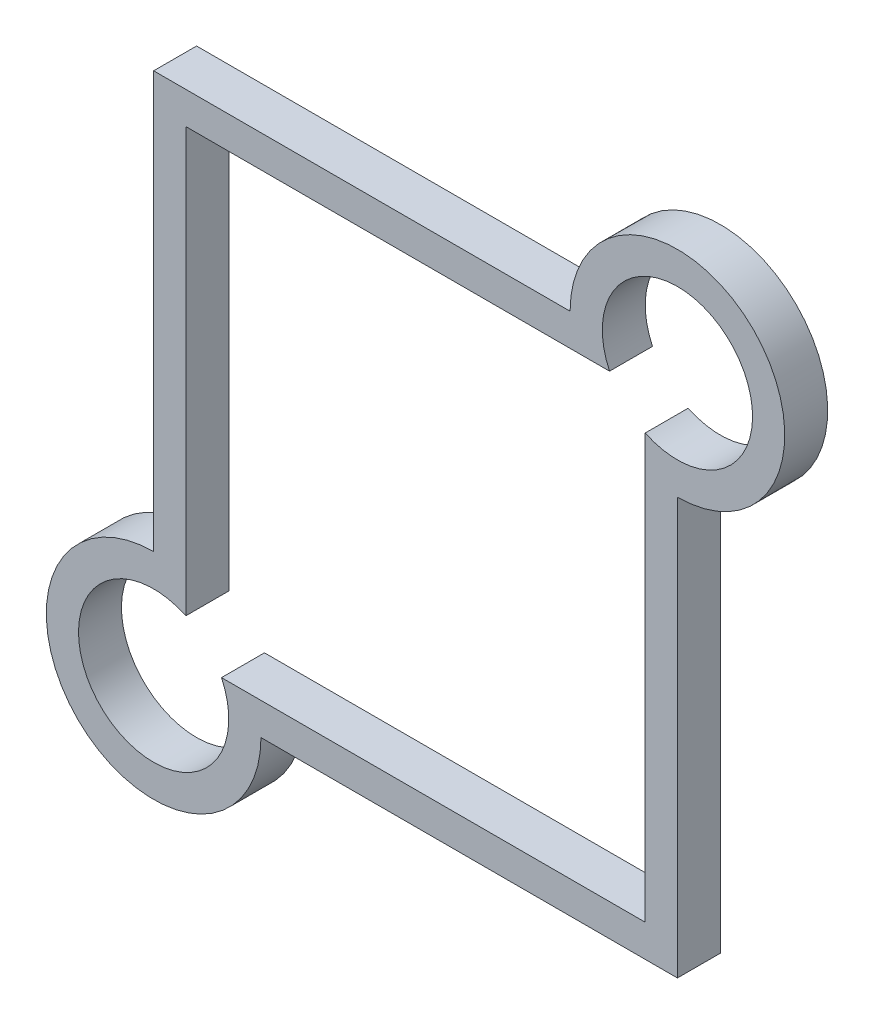
ISO-10303-21;
HEADER;
FILE_DESCRIPTION(('STEP AP214'),'2;1');
FILE_NAME('part.step','',(''),(''),'','','');
FILE_SCHEMA(('AUTOMOTIVE_DESIGN { 1 0 10303 214 1 1 1 1 }'));
ENDSEC;
DATA;
#1=APPLICATION_CONTEXT('core data for automotive mechanical design processes');
#2=APPLICATION_PROTOCOL_DEFINITION('international standard','automotive_design',2000,#1);
#3=PRODUCT_CONTEXT('',#1,'mechanical');
#4=PRODUCT('Part','Part','',(#3));
#5=PRODUCT_RELATED_PRODUCT_CATEGORY('part','',(#4));
#6=PRODUCT_DEFINITION_FORMATION('','',#4);
#7=PRODUCT_DEFINITION_CONTEXT('part definition',#1,'design');
#8=PRODUCT_DEFINITION('design','',#6,#7);
#9=PRODUCT_DEFINITION_SHAPE('','',#8);
#10=(LENGTH_UNIT() NAMED_UNIT(*) SI_UNIT(.MILLI.,.METRE.));
#11=(NAMED_UNIT(*) PLANE_ANGLE_UNIT() SI_UNIT($,.RADIAN.));
#12=(NAMED_UNIT(*) SI_UNIT($,.STERADIAN.) SOLID_ANGLE_UNIT());
#13=UNCERTAINTY_MEASURE_WITH_UNIT(LENGTH_MEASURE(1.E-05),#10,'distance_accuracy_value','');
#14=(GEOMETRIC_REPRESENTATION_CONTEXT(3) GLOBAL_UNCERTAINTY_ASSIGNED_CONTEXT((#13)) GLOBAL_UNIT_ASSIGNED_CONTEXT((#10,
#11,#12)) REPRESENTATION_CONTEXT('',''));
#15=CARTESIAN_POINT('',(0.,0.,0.));
#16=DIRECTION('',(0.,0.,1.));
#17=DIRECTION('',(1.,0.,0.));
#18=AXIS2_PLACEMENT_3D('',#15,#16,#17);
#19=CARTESIAN_POINT('',(122.,122.,20.));
#20=DIRECTION('',(0.,0.,1.));
#21=DIRECTION('',(1.,0.,0.));
#22=AXIS2_PLACEMENT_3D('',#19,#20,#21);
#23=PLANE('',#22);
#24=CARTESIAN_POINT('',(122.,122.,20.));
#25=DIRECTION('',(0.,0.,1.));
#26=DIRECTION('',(1.,0.,0.));
#27=AXIS2_PLACEMENT_3D('',#24,#25,#26);
#28=CIRCLE('',#27,50.);
#29=CARTESIAN_POINT('',(122.,72.,20.));
#30=VERTEX_POINT('',#29);
#31=CARTESIAN_POINT('',(72.,122.,20.));
#32=VERTEX_POINT('',#31);
#33=EDGE_CURVE('E179',#30,#32,#28,.T.);
#34=ORIENTED_EDGE('',*,*,#33,.T.);
#35=DIRECTION('',(-1.,0.,0.));
#36=VECTOR('',#35,1.);
#37=CARTESIAN_POINT('',(-122.,122.,20.));
#38=LINE('',#37,#36);
#39=CARTESIAN_POINT('',(-122.,122.,20.));
#40=VERTEX_POINT('',#39);
#41=EDGE_CURVE('E182',#32,#40,#38,.T.);
#42=ORIENTED_EDGE('',*,*,#41,.T.);
#43=DIRECTION('',(0.,-1.,0.));
#44=VECTOR('',#43,1.);
#45=CARTESIAN_POINT('',(-122.,122.,20.));
#46=LINE('',#45,#44);
#47=CARTESIAN_POINT('',(-122.,-72.,20.));
#48=VERTEX_POINT('',#47);
#49=EDGE_CURVE('E185',#40,#48,#46,.T.);
#50=ORIENTED_EDGE('',*,*,#49,.T.);
#51=CARTESIAN_POINT('',(-122.,-122.,20.));
#52=DIRECTION('',(0.,0.,1.));
#53=DIRECTION('',(1.,0.,0.));
#54=AXIS2_PLACEMENT_3D('',#51,#52,#53);
#55=CIRCLE('',#54,50.);
#56=CARTESIAN_POINT('',(-72.,-122.,20.));
#57=VERTEX_POINT('',#56);
#58=EDGE_CURVE('E187',#48,#57,#55,.T.);
#59=ORIENTED_EDGE('',*,*,#58,.T.);
#60=DIRECTION('',(1.,0.,0.));
#61=VECTOR('',#60,1.);
#62=CARTESIAN_POINT('',(-72.,-122.,20.));
#63=LINE('',#62,#61);
#64=CARTESIAN_POINT('',(122.,-122.,20.));
#65=VERTEX_POINT('',#64);
#66=EDGE_CURVE('E189',#57,#65,#63,.T.);
#67=ORIENTED_EDGE('',*,*,#66,.T.);
#68=DIRECTION('',(0.,1.,0.));
#69=VECTOR('',#68,1.);
#70=CARTESIAN_POINT('',(122.,72.,20.));
#71=LINE('',#70,#69);
#72=EDGE_CURVE('E191',#65,#30,#71,.T.);
#73=ORIENTED_EDGE('',*,*,#72,.T.);
#74=EDGE_LOOP('',(#34,#42,#50,#59,#67,#73));
#75=FACE_BOUND('',#74,.T.);
#76=CARTESIAN_POINT('',(122.,122.,20.));
#77=DIRECTION('',(0.,0.,1.));
#78=DIRECTION('',(1.,0.,0.));
#79=AXIS2_PLACEMENT_3D('',#76,#77,#78);
#80=CIRCLE('',#79,35.);
#81=CARTESIAN_POINT('',(107.,90.3772233983162,20.));
#82=VERTEX_POINT('',#81);
#83=CARTESIAN_POINT('',(90.3772233983162,107.,20.));
#84=VERTEX_POINT('',#83);
#85=EDGE_CURVE('E136',#82,#84,#80,.T.);
#86=ORIENTED_EDGE('',*,*,#85,.F.);
#87=DIRECTION('',(0.,1.,0.));
#88=VECTOR('',#87,1.);
#89=CARTESIAN_POINT('',(107.,90.3772233983162,20.));
#90=LINE('',#89,#88);
#91=CARTESIAN_POINT('',(107.,-107.,20.));
#92=VERTEX_POINT('',#91);
#93=EDGE_CURVE('E128',#92,#82,#90,.T.);
#94=ORIENTED_EDGE('',*,*,#93,.F.);
#95=DIRECTION('',(1.,0.,0.));
#96=VECTOR('',#95,1.);
#97=CARTESIAN_POINT('',(-90.3772233983162,-107.,20.));
#98=LINE('',#97,#96);
#99=CARTESIAN_POINT('',(-90.3772233983162,-107.,20.));
#100=VERTEX_POINT('',#99);
#101=EDGE_CURVE('E157',#100,#92,#98,.T.);
#102=ORIENTED_EDGE('',*,*,#101,.F.);
#103=CARTESIAN_POINT('',(-122.,-122.,20.));
#104=DIRECTION('',(0.,0.,1.));
#105=DIRECTION('',(1.,0.,0.));
#106=AXIS2_PLACEMENT_3D('',#103,#104,#105);
#107=CIRCLE('',#106,35.);
#108=CARTESIAN_POINT('',(-107.,-90.3772233983162,20.));
#109=VERTEX_POINT('',#108);
#110=EDGE_CURVE('E155',#109,#100,#107,.T.);
#111=ORIENTED_EDGE('',*,*,#110,.F.);
#112=DIRECTION('',(0.,-1.,0.));
#113=VECTOR('',#112,1.);
#114=CARTESIAN_POINT('',(-107.,107.,20.));
#115=LINE('',#114,#113);
#116=CARTESIAN_POINT('',(-107.,107.,20.));
#117=VERTEX_POINT('',#116);
#118=EDGE_CURVE('E151',#117,#109,#115,.T.);
#119=ORIENTED_EDGE('',*,*,#118,.F.);
#120=DIRECTION('',(-1.,0.,0.));
#121=VECTOR('',#120,1.);
#122=CARTESIAN_POINT('',(-107.,107.,20.));
#123=LINE('',#122,#121);
#124=EDGE_CURVE('E149',#84,#117,#123,.T.);
#125=ORIENTED_EDGE('',*,*,#124,.F.);
#126=EDGE_LOOP('',(#86,#94,#102,#111,#119,#125));
#127=FACE_BOUND('',#126,.T.);
#128=ADVANCED_FACE('F39',(#75,#127),#23,.T.);
#129=CARTESIAN_POINT('',(122.,122.,0.));
#130=DIRECTION('',(0.,0.,1.));
#131=DIRECTION('',(1.,0.,0.));
#132=AXIS2_PLACEMENT_3D('',#129,#130,#131);
#133=PLANE('',#132);
#134=CARTESIAN_POINT('',(122.,122.,0.));
#135=DIRECTION('',(0.,0.,1.));
#136=DIRECTION('',(1.,0.,0.));
#137=AXIS2_PLACEMENT_3D('',#134,#135,#136);
#138=CIRCLE('',#137,50.);
#139=CARTESIAN_POINT('',(122.,72.,0.));
#140=VERTEX_POINT('',#139);
#141=CARTESIAN_POINT('',(72.,122.,0.));
#142=VERTEX_POINT('',#141);
#143=EDGE_CURVE('E144',#140,#142,#138,.T.);
#144=ORIENTED_EDGE('',*,*,#143,.F.);
#145=DIRECTION('',(0.,1.,0.));
#146=VECTOR('',#145,1.);
#147=CARTESIAN_POINT('',(122.,72.,0.));
#148=LINE('',#147,#146);
#149=CARTESIAN_POINT('',(122.,-122.,0.));
#150=VERTEX_POINT('',#149);
#151=EDGE_CURVE('E183',#150,#140,#148,.T.);
#152=ORIENTED_EDGE('',*,*,#151,.F.);
#153=DIRECTION('',(1.,0.,0.));
#154=VECTOR('',#153,1.);
#155=CARTESIAN_POINT('',(-72.,-122.,0.));
#156=LINE('',#155,#154);
#157=CARTESIAN_POINT('',(-72.,-122.,0.));
#158=VERTEX_POINT('',#157);
#159=EDGE_CURVE('E202',#158,#150,#156,.T.);
#160=ORIENTED_EDGE('',*,*,#159,.F.);
#161=CARTESIAN_POINT('',(-122.,-122.,0.));
#162=DIRECTION('',(0.,0.,1.));
#163=DIRECTION('',(1.,0.,0.));
#164=AXIS2_PLACEMENT_3D('',#161,#162,#163);
#165=CIRCLE('',#164,50.);
#166=CARTESIAN_POINT('',(-122.,-72.,0.));
#167=VERTEX_POINT('',#166);
#168=EDGE_CURVE('E200',#167,#158,#165,.T.);
#169=ORIENTED_EDGE('',*,*,#168,.F.);
#170=DIRECTION('',(0.,-1.,0.));
#171=VECTOR('',#170,1.);
#172=CARTESIAN_POINT('',(-122.,122.,0.));
#173=LINE('',#172,#171);
#174=CARTESIAN_POINT('',(-122.,122.,0.));
#175=VERTEX_POINT('',#174);
#176=EDGE_CURVE('E198',#175,#167,#173,.T.);
#177=ORIENTED_EDGE('',*,*,#176,.F.);
#178=DIRECTION('',(-1.,0.,0.));
#179=VECTOR('',#178,1.);
#180=CARTESIAN_POINT('',(-122.,122.,0.));
#181=LINE('',#180,#179);
#182=EDGE_CURVE('E196',#142,#175,#181,.T.);
#183=ORIENTED_EDGE('',*,*,#182,.F.);
#184=EDGE_LOOP('',(#144,#152,#160,#169,#177,#183));
#185=FACE_BOUND('',#184,.T.);
#186=DIRECTION('',(0.,1.,0.));
#187=VECTOR('',#186,1.);
#188=CARTESIAN_POINT('',(107.,90.3772233983162,0.));
#189=LINE('',#188,#187);
#190=CARTESIAN_POINT('',(107.,-107.,0.));
#191=VERTEX_POINT('',#190);
#192=CARTESIAN_POINT('',(107.,90.3772233983162,0.));
#193=VERTEX_POINT('',#192);
#194=EDGE_CURVE('E62',#191,#193,#189,.T.);
#195=ORIENTED_EDGE('',*,*,#194,.T.);
#196=CARTESIAN_POINT('',(122.,122.,0.));
#197=DIRECTION('',(0.,0.,1.));
#198=DIRECTION('',(1.,0.,0.));
#199=AXIS2_PLACEMENT_3D('',#196,#197,#198);
#200=CIRCLE('',#199,35.);
#201=CARTESIAN_POINT('',(90.3772233983162,107.,0.));
#202=VERTEX_POINT('',#201);
#203=EDGE_CURVE('E143',#193,#202,#200,.T.);
#204=ORIENTED_EDGE('',*,*,#203,.T.);
#205=DIRECTION('',(-1.,0.,0.));
#206=VECTOR('',#205,1.);
#207=CARTESIAN_POINT('',(-107.,107.,0.));
#208=LINE('',#207,#206);
#209=CARTESIAN_POINT('',(-107.,107.,0.));
#210=VERTEX_POINT('',#209);
#211=EDGE_CURVE('E161',#202,#210,#208,.T.);
#212=ORIENTED_EDGE('',*,*,#211,.T.);
#213=DIRECTION('',(0.,-1.,0.));
#214=VECTOR('',#213,1.);
#215=CARTESIAN_POINT('',(-107.,107.,0.));
#216=LINE('',#215,#214);
#217=CARTESIAN_POINT('',(-107.,-90.3772233983162,0.));
#218=VERTEX_POINT('',#217);
#219=EDGE_CURVE('E164',#210,#218,#216,.T.);
#220=ORIENTED_EDGE('',*,*,#219,.T.);
#221=CARTESIAN_POINT('',(-122.,-122.,0.));
#222=DIRECTION('',(0.,0.,1.));
#223=DIRECTION('',(1.,0.,0.));
#224=AXIS2_PLACEMENT_3D('',#221,#222,#223);
#225=CIRCLE('',#224,35.);
#226=CARTESIAN_POINT('',(-90.3772233983162,-107.,0.));
#227=VERTEX_POINT('',#226);
#228=EDGE_CURVE('E167',#218,#227,#225,.T.);
#229=ORIENTED_EDGE('',*,*,#228,.T.);
#230=DIRECTION('',(1.,0.,0.));
#231=VECTOR('',#230,1.);
#232=CARTESIAN_POINT('',(-90.3772233983162,-107.,0.));
#233=LINE('',#232,#231);
#234=EDGE_CURVE('E137',#227,#191,#233,.T.);
#235=ORIENTED_EDGE('',*,*,#234,.T.);
#236=EDGE_LOOP('',(#195,#204,#212,#220,#229,#235));
#237=FACE_BOUND('',#236,.T.);
#238=ADVANCED_FACE('F226',(#185,#237),#133,.F.);
#239=CARTESIAN_POINT('',(122.,122.,20.));
#240=DIRECTION('',(0.,0.,-1.));
#241=DIRECTION('',(-1.,0.,0.));
#242=AXIS2_PLACEMENT_3D('',#239,#240,#241);
#243=CYLINDRICAL_SURFACE('',#242,50.);
#244=ORIENTED_EDGE('',*,*,#143,.T.);
#245=DIRECTION('',(0.,0.,-1.));
#246=VECTOR('',#245,1.);
#247=CARTESIAN_POINT('',(72.,122.,20.));
#248=LINE('',#247,#246);
#249=EDGE_CURVE('E11',#32,#142,#248,.T.);
#250=ORIENTED_EDGE('',*,*,#249,.F.);
#251=ORIENTED_EDGE('',*,*,#33,.F.);
#252=DIRECTION('',(0.,0.,-1.));
#253=VECTOR('',#252,1.);
#254=CARTESIAN_POINT('',(122.,72.,20.));
#255=LINE('',#254,#253);
#256=EDGE_CURVE('E193',#30,#140,#255,.T.);
#257=ORIENTED_EDGE('',*,*,#256,.T.);
#258=EDGE_LOOP('',(#244,#250,#251,#257));
#259=FACE_BOUND('',#258,.T.);
#260=ADVANCED_FACE('F41',(#259),#243,.T.);
#261=CARTESIAN_POINT('',(-122.,122.,20.));
#262=DIRECTION('',(0.,-1.,0.));
#263=DIRECTION('',(0.,0.,-1.));
#264=AXIS2_PLACEMENT_3D('',#261,#262,#263);
#265=PLANE('',#264);
#266=ORIENTED_EDGE('',*,*,#182,.T.);
#267=DIRECTION('',(0.,0.,-1.));
#268=VECTOR('',#267,1.);
#269=CARTESIAN_POINT('',(-122.,122.,20.));
#270=LINE('',#269,#268);
#271=EDGE_CURVE('E47',#40,#175,#270,.T.);
#272=ORIENTED_EDGE('',*,*,#271,.F.);
#273=ORIENTED_EDGE('',*,*,#41,.F.);
#274=ORIENTED_EDGE('',*,*,#249,.T.);
#275=EDGE_LOOP('',(#266,#272,#273,#274));
#276=FACE_BOUND('',#275,.T.);
#277=ADVANCED_FACE('F243',(#276),#265,.F.);
#278=CARTESIAN_POINT('',(-122.,122.,20.));
#279=DIRECTION('',(1.,0.,0.));
#280=DIRECTION('',(0.,0.,-1.));
#281=AXIS2_PLACEMENT_3D('',#278,#279,#280);
#282=PLANE('',#281);
#283=ORIENTED_EDGE('',*,*,#176,.T.);
#284=DIRECTION('',(0.,0.,-1.));
#285=VECTOR('',#284,1.);
#286=CARTESIAN_POINT('',(-122.,-72.,20.));
#287=LINE('',#286,#285);
#288=EDGE_CURVE('E213',#48,#167,#287,.T.);
#289=ORIENTED_EDGE('',*,*,#288,.F.);
#290=ORIENTED_EDGE('',*,*,#49,.F.);
#291=ORIENTED_EDGE('',*,*,#271,.T.);
#292=EDGE_LOOP('',(#283,#289,#290,#291));
#293=FACE_BOUND('',#292,.T.);
#294=ADVANCED_FACE('F220',(#293),#282,.F.);
#295=CARTESIAN_POINT('',(-122.,-122.,20.));
#296=DIRECTION('',(0.,0.,-1.));
#297=DIRECTION('',(-1.,0.,0.));
#298=AXIS2_PLACEMENT_3D('',#295,#296,#297);
#299=CYLINDRICAL_SURFACE('',#298,50.);
#300=ORIENTED_EDGE('',*,*,#168,.T.);
#301=DIRECTION('',(0.,0.,-1.));
#302=VECTOR('',#301,1.);
#303=CARTESIAN_POINT('',(-72.,-122.,20.));
#304=LINE('',#303,#302);
#305=EDGE_CURVE('E210',#57,#158,#304,.T.);
#306=ORIENTED_EDGE('',*,*,#305,.F.);
#307=ORIENTED_EDGE('',*,*,#58,.F.);
#308=ORIENTED_EDGE('',*,*,#288,.T.);
#309=EDGE_LOOP('',(#300,#306,#307,#308));
#310=FACE_BOUND('',#309,.T.);
#311=ADVANCED_FACE('F232',(#310),#299,.T.);
#312=CARTESIAN_POINT('',(-72.,-122.,20.));
#313=DIRECTION('',(0.,1.,0.));
#314=DIRECTION('',(-1.,0.,0.));
#315=AXIS2_PLACEMENT_3D('',#312,#313,#314);
#316=PLANE('',#315);
#317=ORIENTED_EDGE('',*,*,#159,.T.);
#318=DIRECTION('',(0.,0.,-1.));
#319=VECTOR('',#318,1.);
#320=CARTESIAN_POINT('',(122.,-122.,20.));
#321=LINE('',#320,#319);
#322=EDGE_CURVE('E207',#65,#150,#321,.T.);
#323=ORIENTED_EDGE('',*,*,#322,.F.);
#324=ORIENTED_EDGE('',*,*,#66,.F.);
#325=ORIENTED_EDGE('',*,*,#305,.T.);
#326=EDGE_LOOP('',(#317,#323,#324,#325));
#327=FACE_BOUND('',#326,.T.);
#328=ADVANCED_FACE('F236',(#327),#316,.F.);
#329=CARTESIAN_POINT('',(122.,72.,20.));
#330=DIRECTION('',(-1.,0.,0.));
#331=DIRECTION('',(0.,-1.,0.));
#332=AXIS2_PLACEMENT_3D('',#329,#330,#331);
#333=PLANE('',#332);
#334=ORIENTED_EDGE('',*,*,#151,.T.);
#335=ORIENTED_EDGE('',*,*,#256,.F.);
#336=ORIENTED_EDGE('',*,*,#72,.F.);
#337=ORIENTED_EDGE('',*,*,#322,.T.);
#338=EDGE_LOOP('',(#334,#335,#336,#337));
#339=FACE_BOUND('',#338,.T.);
#340=ADVANCED_FACE('F246',(#339),#333,.F.);
#341=CARTESIAN_POINT('',(107.,90.3772233983162,20.));
#342=DIRECTION('',(-1.,0.,0.));
#343=DIRECTION('',(0.,0.,1.));
#344=AXIS2_PLACEMENT_3D('',#341,#342,#343);
#345=PLANE('',#344);
#346=ORIENTED_EDGE('',*,*,#194,.F.);
#347=DIRECTION('',(0.,0.,-1.));
#348=VECTOR('',#347,1.);
#349=CARTESIAN_POINT('',(107.,-107.,20.));
#350=LINE('',#349,#348);
#351=EDGE_CURVE('E132',#92,#191,#350,.T.);
#352=ORIENTED_EDGE('',*,*,#351,.F.);
#353=ORIENTED_EDGE('',*,*,#93,.T.);
#354=DIRECTION('',(0.,0.,-1.));
#355=VECTOR('',#354,1.);
#356=CARTESIAN_POINT('',(107.,90.3772233983162,20.));
#357=LINE('',#356,#355);
#358=EDGE_CURVE('E131',#82,#193,#357,.T.);
#359=ORIENTED_EDGE('',*,*,#358,.T.);
#360=EDGE_LOOP('',(#346,#352,#353,#359));
#361=FACE_BOUND('',#360,.T.);
#362=ADVANCED_FACE('F130',(#361),#345,.T.);
#363=CARTESIAN_POINT('',(122.,122.,20.));
#364=DIRECTION('',(0.,0.,-1.));
#365=DIRECTION('',(-1.,0.,0.));
#366=AXIS2_PLACEMENT_3D('',#363,#364,#365);
#367=CYLINDRICAL_SURFACE('',#366,35.);
#368=ORIENTED_EDGE('',*,*,#203,.F.);
#369=ORIENTED_EDGE('',*,*,#358,.F.);
#370=ORIENTED_EDGE('',*,*,#85,.T.);
#371=DIRECTION('',(0.,0.,-1.));
#372=VECTOR('',#371,1.);
#373=CARTESIAN_POINT('',(90.3772233983162,107.,20.));
#374=LINE('',#373,#372);
#375=EDGE_CURVE('E145',#84,#202,#374,.T.);
#376=ORIENTED_EDGE('',*,*,#375,.T.);
#377=EDGE_LOOP('',(#368,#369,#370,#376));
#378=FACE_BOUND('',#377,.T.);
#379=ADVANCED_FACE('F140',(#378),#367,.F.);
#380=CARTESIAN_POINT('',(-107.,107.,20.));
#381=DIRECTION('',(0.,-1.,0.));
#382=DIRECTION('',(0.,0.,-1.));
#383=AXIS2_PLACEMENT_3D('',#380,#381,#382);
#384=PLANE('',#383);
#385=ORIENTED_EDGE('',*,*,#211,.F.);
#386=ORIENTED_EDGE('',*,*,#375,.F.);
#387=ORIENTED_EDGE('',*,*,#124,.T.);
#388=DIRECTION('',(0.,0.,-1.));
#389=VECTOR('',#388,1.);
#390=CARTESIAN_POINT('',(-107.,107.,20.));
#391=LINE('',#390,#389);
#392=EDGE_CURVE('E176',#117,#210,#391,.T.);
#393=ORIENTED_EDGE('',*,*,#392,.T.);
#394=EDGE_LOOP('',(#385,#386,#387,#393));
#395=FACE_BOUND('',#394,.T.);
#396=ADVANCED_FACE('F264',(#395),#384,.T.);
#397=CARTESIAN_POINT('',(-107.,107.,20.));
#398=DIRECTION('',(1.,0.,0.));
#399=DIRECTION('',(0.,0.,-1.));
#400=AXIS2_PLACEMENT_3D('',#397,#398,#399);
#401=PLANE('',#400);
#402=ORIENTED_EDGE('',*,*,#219,.F.);
#403=ORIENTED_EDGE('',*,*,#392,.F.);
#404=ORIENTED_EDGE('',*,*,#118,.T.);
#405=DIRECTION('',(0.,0.,-1.));
#406=VECTOR('',#405,1.);
#407=CARTESIAN_POINT('',(-107.,-90.3772233983162,20.));
#408=LINE('',#407,#406);
#409=EDGE_CURVE('E174',#109,#218,#408,.T.);
#410=ORIENTED_EDGE('',*,*,#409,.T.);
#411=EDGE_LOOP('',(#402,#403,#404,#410));
#412=FACE_BOUND('',#411,.T.);
#413=ADVANCED_FACE('F267',(#412),#401,.T.);
#414=CARTESIAN_POINT('',(-122.,-122.,20.));
#415=DIRECTION('',(0.,0.,-1.));
#416=DIRECTION('',(-1.,0.,0.));
#417=AXIS2_PLACEMENT_3D('',#414,#415,#416);
#418=CYLINDRICAL_SURFACE('',#417,35.);
#419=ORIENTED_EDGE('',*,*,#228,.F.);
#420=ORIENTED_EDGE('',*,*,#409,.F.);
#421=ORIENTED_EDGE('',*,*,#110,.T.);
#422=DIRECTION('',(0.,0.,-1.));
#423=VECTOR('',#422,1.);
#424=CARTESIAN_POINT('',(-90.3772233983162,-107.,20.));
#425=LINE('',#424,#423);
#426=EDGE_CURVE('E54',#100,#227,#425,.T.);
#427=ORIENTED_EDGE('',*,*,#426,.T.);
#428=EDGE_LOOP('',(#419,#420,#421,#427));
#429=FACE_BOUND('',#428,.T.);
#430=ADVANCED_FACE('F271',(#429),#418,.F.);
#431=CARTESIAN_POINT('',(-90.3772233983162,-107.,20.));
#432=DIRECTION('',(0.,1.,0.));
#433=DIRECTION('',(0.,0.,1.));
#434=AXIS2_PLACEMENT_3D('',#431,#432,#433);
#435=PLANE('',#434);
#436=ORIENTED_EDGE('',*,*,#234,.F.);
#437=ORIENTED_EDGE('',*,*,#426,.F.);
#438=ORIENTED_EDGE('',*,*,#101,.T.);
#439=ORIENTED_EDGE('',*,*,#351,.T.);
#440=EDGE_LOOP('',(#436,#437,#438,#439));
#441=FACE_BOUND('',#440,.T.);
#442=ADVANCED_FACE('F275',(#441),#435,.T.);
#443=CLOSED_SHELL('',(#128,#238,#260,#277,#294,#311,#328,#340,#362,#379,#396,#413,#430,#442));
#444=MANIFOLD_SOLID_BREP('B2',#443);
#445=ADVANCED_BREP_SHAPE_REPRESENTATION('',(#18,#444),#14);
#446=SHAPE_DEFINITION_REPRESENTATION(#9,#445);
ENDSEC;
END-ISO-10303-21;
